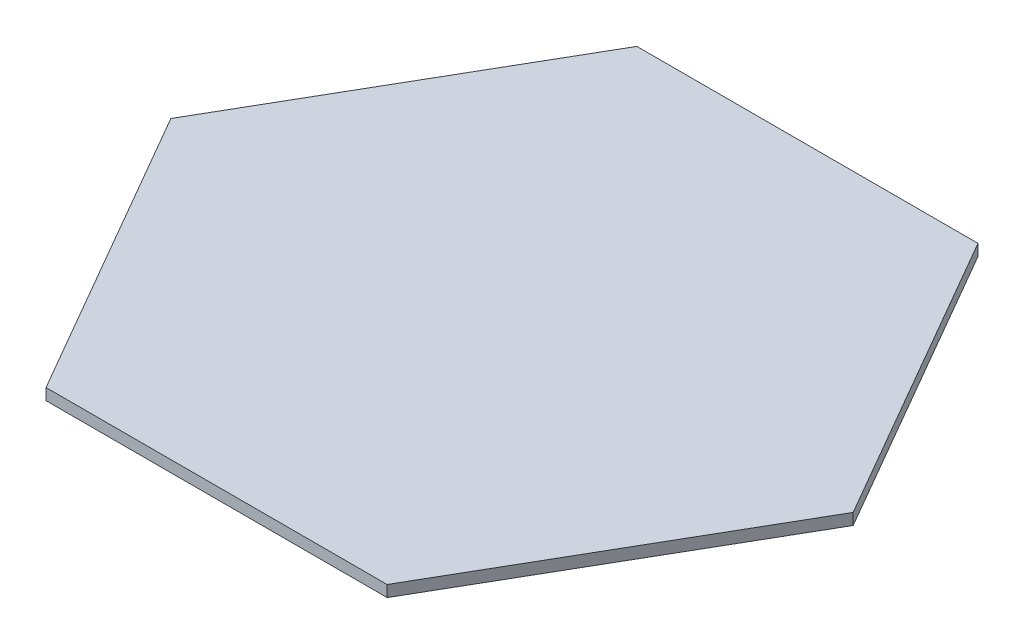
ISO-10303-21;
HEADER;
FILE_DESCRIPTION(('STEP AP214'),'2;1');
FILE_NAME('part.step','',(''),(''),'','','');
FILE_SCHEMA(('AUTOMOTIVE_DESIGN { 1 0 10303 214 1 1 1 1 }'));
ENDSEC;
DATA;
#1=APPLICATION_CONTEXT('core data for automotive mechanical design processes');
#2=APPLICATION_PROTOCOL_DEFINITION('international standard','automotive_design',2000,#1);
#3=PRODUCT_CONTEXT('',#1,'mechanical');
#4=PRODUCT('Part','Part','',(#3));
#5=PRODUCT_RELATED_PRODUCT_CATEGORY('part','',(#4));
#6=PRODUCT_DEFINITION_FORMATION('','',#4);
#7=PRODUCT_DEFINITION_CONTEXT('part definition',#1,'design');
#8=PRODUCT_DEFINITION('design','',#6,#7);
#9=PRODUCT_DEFINITION_SHAPE('','',#8);
#10=(LENGTH_UNIT() NAMED_UNIT(*) SI_UNIT(.MILLI.,.METRE.));
#11=(NAMED_UNIT(*) PLANE_ANGLE_UNIT() SI_UNIT($,.RADIAN.));
#12=(NAMED_UNIT(*) SI_UNIT($,.STERADIAN.) SOLID_ANGLE_UNIT());
#13=UNCERTAINTY_MEASURE_WITH_UNIT(LENGTH_MEASURE(1.E-05),#10,'distance_accuracy_value','');
#14=(GEOMETRIC_REPRESENTATION_CONTEXT(3) GLOBAL_UNCERTAINTY_ASSIGNED_CONTEXT((#13)) GLOBAL_UNIT_ASSIGNED_CONTEXT((#10,
#11,#12)) REPRESENTATION_CONTEXT('',''));
#15=CARTESIAN_POINT('',(0.,0.,0.));
#16=DIRECTION('',(0.,0.,1.));
#17=DIRECTION('',(1.,0.,0.));
#18=AXIS2_PLACEMENT_3D('',#15,#16,#17);
#19=CARTESIAN_POINT('',(37.5000000000008,2.5,64.9519052838324));
#20=DIRECTION('',(-0.866025403784442,0.,-0.499999999999995));
#21=DIRECTION('',(-0.499999999999995,0.,0.866025403784442));
#22=AXIS2_PLACEMENT_3D('',#19,#20,#21);
#23=PLANE('',#22);
#24=DIRECTION('',(0.499999999999995,0.,-0.866025403784441));
#25=VECTOR('',#24,1.);
#26=CARTESIAN_POINT('',(37.5000000000008,0.,64.9519052838324));
#27=LINE('',#26,#25);
#28=CARTESIAN_POINT('',(37.5000000000008,0.,64.9519052838324));
#29=VERTEX_POINT('',#28);
#30=CARTESIAN_POINT('',(75.,0.,0.));
#31=VERTEX_POINT('',#30);
#32=EDGE_CURVE('E120',#29,#31,#27,.T.);
#33=ORIENTED_EDGE('',*,*,#32,.T.);
#34=DIRECTION('',(0.,-1.,0.));
#35=VECTOR('',#34,1.);
#36=CARTESIAN_POINT('',(75.,2.5,0.));
#37=LINE('',#36,#35);
#38=CARTESIAN_POINT('',(75.,2.5,0.));
#39=VERTEX_POINT('',#38);
#40=EDGE_CURVE('E11',#39,#31,#37,.T.);
#41=ORIENTED_EDGE('',*,*,#40,.F.);
#42=DIRECTION('',(0.499999999999995,0.,-0.866025403784441));
#43=VECTOR('',#42,1.);
#44=CARTESIAN_POINT('',(37.5000000000008,2.5,64.9519052838324));
#45=LINE('',#44,#43);
#46=CARTESIAN_POINT('',(37.5000000000008,2.5,64.9519052838324));
#47=VERTEX_POINT('',#46);
#48=EDGE_CURVE('E130',#47,#39,#45,.T.);
#49=ORIENTED_EDGE('',*,*,#48,.F.);
#50=DIRECTION('',(0.,-1.,0.));
#51=VECTOR('',#50,1.);
#52=CARTESIAN_POINT('',(37.5000000000008,2.5,64.9519052838324));
#53=LINE('',#52,#51);
#54=EDGE_CURVE('E116',#47,#29,#53,.T.);
#55=ORIENTED_EDGE('',*,*,#54,.T.);
#56=EDGE_LOOP('',(#33,#41,#49,#55));
#57=FACE_BOUND('',#56,.T.);
#58=ADVANCED_FACE('F36',(#57),#23,.F.);
#59=CARTESIAN_POINT('',(75.,2.5,0.));
#60=DIRECTION('',(-0.866025403784438,0.,0.500000000000001));
#61=DIRECTION('',(0.500000000000001,0.,0.866025403784438));
#62=AXIS2_PLACEMENT_3D('',#59,#60,#61);
#63=PLANE('',#62);
#64=DIRECTION('',(-0.500000000000001,0.,-0.866025403784438));
#65=VECTOR('',#64,1.);
#66=CARTESIAN_POINT('',(75.,0.,0.));
#67=LINE('',#66,#65);
#68=CARTESIAN_POINT('',(37.4999999999998,0.,-64.951905283833));
#69=VERTEX_POINT('',#68);
#70=EDGE_CURVE('E123',#31,#69,#67,.T.);
#71=ORIENTED_EDGE('',*,*,#70,.T.);
#72=DIRECTION('',(0.,-1.,0.));
#73=VECTOR('',#72,1.);
#74=CARTESIAN_POINT('',(37.4999999999998,2.5,-64.951905283833));
#75=LINE('',#74,#73);
#76=CARTESIAN_POINT('',(37.4999999999998,2.5,-64.951905283833));
#77=VERTEX_POINT('',#76);
#78=EDGE_CURVE('E44',#77,#69,#75,.T.);
#79=ORIENTED_EDGE('',*,*,#78,.F.);
#80=DIRECTION('',(-0.500000000000001,0.,-0.866025403784438));
#81=VECTOR('',#80,1.);
#82=CARTESIAN_POINT('',(75.,2.5,0.));
#83=LINE('',#82,#81);
#84=EDGE_CURVE('E89',#39,#77,#83,.T.);
#85=ORIENTED_EDGE('',*,*,#84,.F.);
#86=ORIENTED_EDGE('',*,*,#40,.T.);
#87=EDGE_LOOP('',(#71,#79,#85,#86));
#88=FACE_BOUND('',#87,.T.);
#89=ADVANCED_FACE('F154',(#88),#63,.F.);
#90=CARTESIAN_POINT('',(37.4999999999998,2.5,-64.951905283833));
#91=DIRECTION('',(0.,0.,1.));
#92=DIRECTION('',(1.,0.,0.));
#93=AXIS2_PLACEMENT_3D('',#90,#91,#92);
#94=PLANE('',#93);
#95=DIRECTION('',(-1.,0.,0.));
#96=VECTOR('',#95,1.);
#97=CARTESIAN_POINT('',(37.4999999999998,0.,-64.951905283833));
#98=LINE('',#97,#96);
#99=CARTESIAN_POINT('',(-37.5000000000003,0.,-64.9519052838327));
#100=VERTEX_POINT('',#99);
#101=EDGE_CURVE('E125',#69,#100,#98,.T.);
#102=ORIENTED_EDGE('',*,*,#101,.T.);
#103=DIRECTION('',(0.,-1.,0.));
#104=VECTOR('',#103,1.);
#105=CARTESIAN_POINT('',(-37.5000000000003,2.5,-64.9519052838327));
#106=LINE('',#105,#104);
#107=CARTESIAN_POINT('',(-37.5000000000003,2.5,-64.9519052838327));
#108=VERTEX_POINT('',#107);
#109=EDGE_CURVE('E111',#108,#100,#106,.T.);
#110=ORIENTED_EDGE('',*,*,#109,.F.);
#111=DIRECTION('',(-1.,0.,0.));
#112=VECTOR('',#111,1.);
#113=CARTESIAN_POINT('',(37.4999999999998,2.5,-64.951905283833));
#114=LINE('',#113,#112);
#115=EDGE_CURVE('E102',#77,#108,#114,.T.);
#116=ORIENTED_EDGE('',*,*,#115,.F.);
#117=ORIENTED_EDGE('',*,*,#78,.T.);
#118=EDGE_LOOP('',(#102,#110,#116,#117));
#119=FACE_BOUND('',#118,.T.);
#120=ADVANCED_FACE('F136',(#119),#94,.F.);
#121=CARTESIAN_POINT('',(-37.5000000000003,2.5,-64.9519052838327));
#122=DIRECTION('',(0.866025403784442,0.,0.499999999999995));
#123=DIRECTION('',(0.499999999999995,0.,-0.866025403784442));
#124=AXIS2_PLACEMENT_3D('',#121,#122,#123);
#125=PLANE('',#124);
#126=DIRECTION('',(-0.499999999999995,0.,0.866025403784442));
#127=VECTOR('',#126,1.);
#128=CARTESIAN_POINT('',(-37.5000000000003,0.,-64.9519052838327));
#129=LINE('',#128,#127);
#130=CARTESIAN_POINT('',(-75.,0.,5.2372220082647E-13));
#131=VERTEX_POINT('',#130);
#132=EDGE_CURVE('E110',#100,#131,#129,.T.);
#133=ORIENTED_EDGE('',*,*,#132,.T.);
#134=DIRECTION('',(0.,-1.,0.));
#135=VECTOR('',#134,1.);
#136=CARTESIAN_POINT('',(-75.,2.5,5.2372220082647E-13));
#137=LINE('',#136,#135);
#138=CARTESIAN_POINT('',(-75.,2.5,5.2372220082647E-13));
#139=VERTEX_POINT('',#138);
#140=EDGE_CURVE('E107',#139,#131,#137,.T.);
#141=ORIENTED_EDGE('',*,*,#140,.F.);
#142=DIRECTION('',(-0.499999999999995,0.,0.866025403784442));
#143=VECTOR('',#142,1.);
#144=CARTESIAN_POINT('',(-37.5000000000003,2.5,-64.9519052838327));
#145=LINE('',#144,#143);
#146=EDGE_CURVE('E96',#108,#139,#145,.T.);
#147=ORIENTED_EDGE('',*,*,#146,.F.);
#148=ORIENTED_EDGE('',*,*,#109,.T.);
#149=EDGE_LOOP('',(#133,#141,#147,#148));
#150=FACE_BOUND('',#149,.T.);
#151=ADVANCED_FACE('F108',(#150),#125,.F.);
#152=CARTESIAN_POINT('',(-75.,2.5,5.2372220082647E-13));
#153=DIRECTION('',(0.866025403784435,0.,-0.500000000000007));
#154=DIRECTION('',(-0.500000000000007,0.,-0.866025403784435));
#155=AXIS2_PLACEMENT_3D('',#152,#153,#154);
#156=PLANE('',#155);
#157=DIRECTION('',(0.500000000000007,0.,0.866025403784435));
#158=VECTOR('',#157,1.);
#159=CARTESIAN_POINT('',(-75.,0.,5.2372220082647E-13));
#160=LINE('',#159,#158);
#161=CARTESIAN_POINT('',(-37.4999999999994,0.,64.9519052838332));
#162=VERTEX_POINT('',#161);
#163=EDGE_CURVE('E75',#131,#162,#160,.T.);
#164=ORIENTED_EDGE('',*,*,#163,.T.);
#165=DIRECTION('',(0.,-1.,0.));
#166=VECTOR('',#165,1.);
#167=CARTESIAN_POINT('',(-37.4999999999994,2.5,64.9519052838332));
#168=LINE('',#167,#166);
#169=CARTESIAN_POINT('',(-37.4999999999994,2.5,64.9519052838332));
#170=VERTEX_POINT('',#169);
#171=EDGE_CURVE('E112',#170,#162,#168,.T.);
#172=ORIENTED_EDGE('',*,*,#171,.F.);
#173=DIRECTION('',(0.500000000000007,0.,0.866025403784435));
#174=VECTOR('',#173,1.);
#175=CARTESIAN_POINT('',(-75.,2.5,5.2372220082647E-13));
#176=LINE('',#175,#174);
#177=EDGE_CURVE('E100',#139,#170,#176,.T.);
#178=ORIENTED_EDGE('',*,*,#177,.F.);
#179=ORIENTED_EDGE('',*,*,#140,.T.);
#180=EDGE_LOOP('',(#164,#172,#178,#179));
#181=FACE_BOUND('',#180,.T.);
#182=ADVANCED_FACE('F114',(#181),#156,.F.);
#183=CARTESIAN_POINT('',(-37.4999999999994,2.5,64.9519052838332));
#184=DIRECTION('',(0.,0.,-1.));
#185=DIRECTION('',(-1.,0.,0.));
#186=AXIS2_PLACEMENT_3D('',#183,#184,#185);
#187=PLANE('',#186);
#188=DIRECTION('',(1.,0.,0.));
#189=VECTOR('',#188,1.);
#190=CARTESIAN_POINT('',(-37.4999999999994,0.,64.9519052838332));
#191=LINE('',#190,#189);
#192=EDGE_CURVE('E81',#162,#29,#191,.T.);
#193=ORIENTED_EDGE('',*,*,#192,.T.);
#194=ORIENTED_EDGE('',*,*,#54,.F.);
#195=DIRECTION('',(1.,0.,0.));
#196=VECTOR('',#195,1.);
#197=CARTESIAN_POINT('',(-37.4999999999994,2.5,64.9519052838332));
#198=LINE('',#197,#196);
#199=EDGE_CURVE('E52',#170,#47,#198,.T.);
#200=ORIENTED_EDGE('',*,*,#199,.F.);
#201=ORIENTED_EDGE('',*,*,#171,.T.);
#202=EDGE_LOOP('',(#193,#194,#200,#201));
#203=FACE_BOUND('',#202,.T.);
#204=ADVANCED_FACE('F143',(#203),#187,.F.);
#205=CARTESIAN_POINT('',(0.,2.5,0.));
#206=DIRECTION('',(0.,1.,0.));
#207=DIRECTION('',(0.,0.,1.));
#208=AXIS2_PLACEMENT_3D('',#205,#206,#207);
#209=PLANE('',#208);
#210=ORIENTED_EDGE('',*,*,#48,.T.);
#211=ORIENTED_EDGE('',*,*,#84,.T.);
#212=ORIENTED_EDGE('',*,*,#115,.T.);
#213=ORIENTED_EDGE('',*,*,#146,.T.);
#214=ORIENTED_EDGE('',*,*,#177,.T.);
#215=ORIENTED_EDGE('',*,*,#199,.T.);
#216=EDGE_LOOP('',(#210,#211,#212,#213,#214,#215));
#217=FACE_BOUND('',#216,.T.);
#218=ADVANCED_FACE('F98',(#217),#209,.T.);
#219=CARTESIAN_POINT('',(0.,0.,0.));
#220=DIRECTION('',(0.,1.,0.));
#221=DIRECTION('',(0.,0.,1.));
#222=AXIS2_PLACEMENT_3D('',#219,#220,#221);
#223=PLANE('',#222);
#224=ORIENTED_EDGE('',*,*,#32,.F.);
#225=ORIENTED_EDGE('',*,*,#192,.F.);
#226=ORIENTED_EDGE('',*,*,#163,.F.);
#227=ORIENTED_EDGE('',*,*,#132,.F.);
#228=ORIENTED_EDGE('',*,*,#101,.F.);
#229=ORIENTED_EDGE('',*,*,#70,.F.);
#230=EDGE_LOOP('',(#224,#225,#226,#227,#228,#229));
#231=FACE_BOUND('',#230,.T.);
#232=ADVANCED_FACE('F139',(#231),#223,.F.);
#233=CLOSED_SHELL('',(#58,#89,#120,#151,#182,#204,#218,#232));
#234=MANIFOLD_SOLID_BREP('B2',#233);
#235=ADVANCED_BREP_SHAPE_REPRESENTATION('',(#18,#234),#14);
#236=SHAPE_DEFINITION_REPRESENTATION(#9,#235);
ENDSEC;
END-ISO-10303-21;
